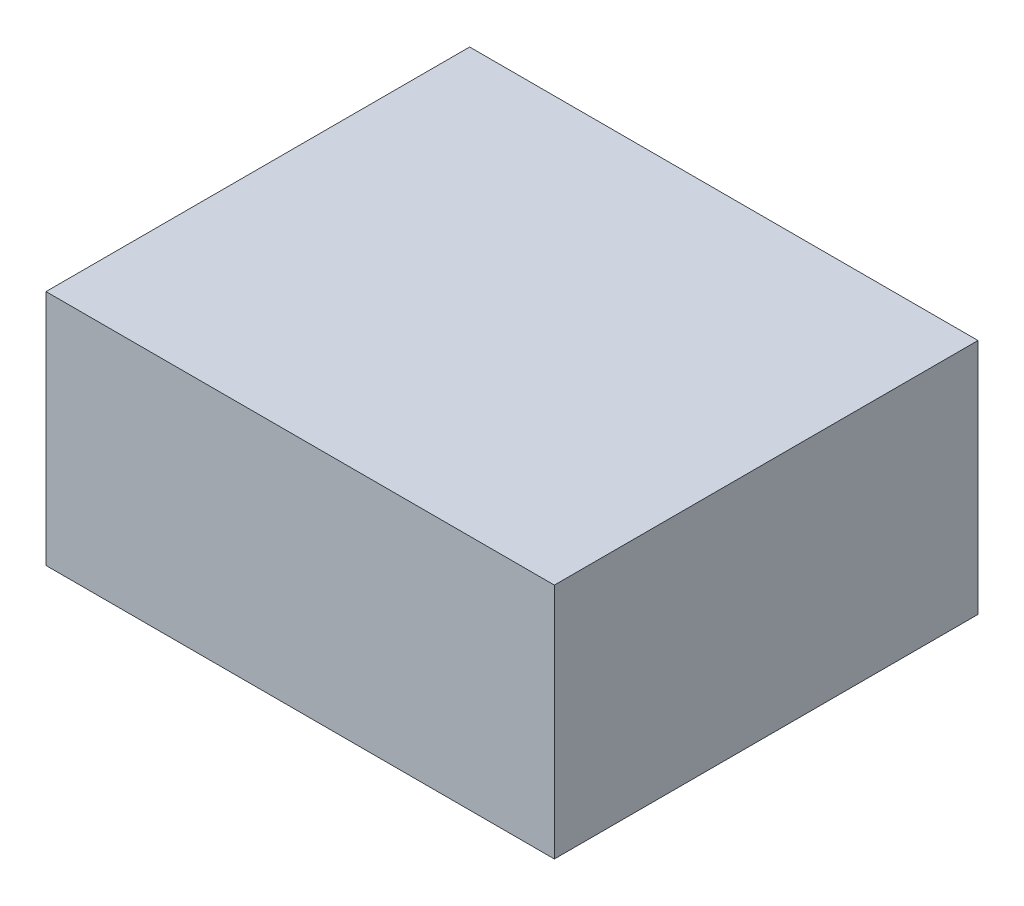
ISO-10303-21;
HEADER;
FILE_DESCRIPTION(('STEP AP214'),'2;1');
FILE_NAME('part.step','',(''),(''),'','','');
FILE_SCHEMA(('AUTOMOTIVE_DESIGN { 1 0 10303 214 1 1 1 1 }'));
ENDSEC;
DATA;
#1=APPLICATION_CONTEXT('core data for automotive mechanical design processes');
#2=APPLICATION_PROTOCOL_DEFINITION('international standard','automotive_design',2000,#1);
#3=PRODUCT_CONTEXT('',#1,'mechanical');
#4=PRODUCT('Part','Part','',(#3));
#5=PRODUCT_RELATED_PRODUCT_CATEGORY('part','',(#4));
#6=PRODUCT_DEFINITION_FORMATION('','',#4);
#7=PRODUCT_DEFINITION_CONTEXT('part definition',#1,'design');
#8=PRODUCT_DEFINITION('design','',#6,#7);
#9=PRODUCT_DEFINITION_SHAPE('','',#8);
#10=(LENGTH_UNIT() NAMED_UNIT(*) SI_UNIT(.MILLI.,.METRE.));
#11=(NAMED_UNIT(*) PLANE_ANGLE_UNIT() SI_UNIT($,.RADIAN.));
#12=(NAMED_UNIT(*) SI_UNIT($,.STERADIAN.) SOLID_ANGLE_UNIT());
#13=UNCERTAINTY_MEASURE_WITH_UNIT(LENGTH_MEASURE(1.E-05),#10,'distance_accuracy_value','');
#14=(GEOMETRIC_REPRESENTATION_CONTEXT(3) GLOBAL_UNCERTAINTY_ASSIGNED_CONTEXT((#13)) GLOBAL_UNIT_ASSIGNED_CONTEXT((#10,
#11,#12)) REPRESENTATION_CONTEXT('',''));
#15=CARTESIAN_POINT('',(0.,0.,0.));
#16=DIRECTION('',(0.,0.,1.));
#17=DIRECTION('',(1.,0.,0.));
#18=AXIS2_PLACEMENT_3D('',#15,#16,#17);
#19=CARTESIAN_POINT('',(-45.,42.,37.5));
#20=DIRECTION('',(1.,0.,0.));
#21=DIRECTION('',(0.,0.,-1.));
#22=AXIS2_PLACEMENT_3D('',#19,#20,#21);
#23=PLANE('',#22);
#24=DIRECTION('',(0.,-1.,0.));
#25=VECTOR('',#24,1.);
#26=CARTESIAN_POINT('',(-45.,42.,-37.5));
#27=LINE('',#26,#25);
#28=CARTESIAN_POINT('',(-45.,42.,-37.5));
#29=VERTEX_POINT('',#28);
#30=CARTESIAN_POINT('',(-45.,0.,-37.5));
#31=VERTEX_POINT('',#30);
#32=EDGE_CURVE('E105',#29,#31,#27,.T.);
#33=ORIENTED_EDGE('',*,*,#32,.T.);
#34=DIRECTION('',(0.,0.,-1.));
#35=VECTOR('',#34,1.);
#36=CARTESIAN_POINT('',(-45.,0.,37.5));
#37=LINE('',#36,#35);
#38=CARTESIAN_POINT('',(-45.,0.,37.5));
#39=VERTEX_POINT('',#38);
#40=EDGE_CURVE('E11',#39,#31,#37,.T.);
#41=ORIENTED_EDGE('',*,*,#40,.F.);
#42=DIRECTION('',(0.,-1.,0.));
#43=VECTOR('',#42,1.);
#44=CARTESIAN_POINT('',(-45.,42.,37.5));
#45=LINE('',#44,#43);
#46=CARTESIAN_POINT('',(-45.,42.,37.5));
#47=VERTEX_POINT('',#46);
#48=EDGE_CURVE('E89',#47,#39,#45,.T.);
#49=ORIENTED_EDGE('',*,*,#48,.F.);
#50=DIRECTION('',(0.,0.,-1.));
#51=VECTOR('',#50,1.);
#52=CARTESIAN_POINT('',(-45.,42.,37.5));
#53=LINE('',#52,#51);
#54=EDGE_CURVE('E97',#47,#29,#53,.T.);
#55=ORIENTED_EDGE('',*,*,#54,.T.);
#56=EDGE_LOOP('',(#33,#41,#49,#55));
#57=FACE_BOUND('',#56,.T.);
#58=ADVANCED_FACE('F39',(#57),#23,.F.);
#59=CARTESIAN_POINT('',(-45.,0.,37.5));
#60=DIRECTION('',(0.,1.,0.));
#61=DIRECTION('',(0.,0.,1.));
#62=AXIS2_PLACEMENT_3D('',#59,#60,#61);
#63=PLANE('',#62);
#64=DIRECTION('',(1.,0.,0.));
#65=VECTOR('',#64,1.);
#66=CARTESIAN_POINT('',(-45.,0.,-37.5));
#67=LINE('',#66,#65);
#68=CARTESIAN_POINT('',(45.,0.,-37.5));
#69=VERTEX_POINT('',#68);
#70=EDGE_CURVE('E92',#31,#69,#67,.T.);
#71=ORIENTED_EDGE('',*,*,#70,.T.);
#72=DIRECTION('',(0.,0.,-1.));
#73=VECTOR('',#72,1.);
#74=CARTESIAN_POINT('',(45.,0.,37.5));
#75=LINE('',#74,#73);
#76=CARTESIAN_POINT('',(45.,0.,37.5));
#77=VERTEX_POINT('',#76);
#78=EDGE_CURVE('E50',#77,#69,#75,.T.);
#79=ORIENTED_EDGE('',*,*,#78,.F.);
#80=DIRECTION('',(1.,0.,0.));
#81=VECTOR('',#80,1.);
#82=CARTESIAN_POINT('',(-45.,0.,37.5));
#83=LINE('',#82,#81);
#84=EDGE_CURVE('E82',#39,#77,#83,.T.);
#85=ORIENTED_EDGE('',*,*,#84,.F.);
#86=ORIENTED_EDGE('',*,*,#40,.T.);
#87=EDGE_LOOP('',(#71,#79,#85,#86));
#88=FACE_BOUND('',#87,.T.);
#89=ADVANCED_FACE('F93',(#88),#63,.F.);
#90=CARTESIAN_POINT('',(45.,0.,37.5));
#91=DIRECTION('',(-1.,0.,0.));
#92=DIRECTION('',(0.,0.,1.));
#93=AXIS2_PLACEMENT_3D('',#90,#91,#92);
#94=PLANE('',#93);
#95=DIRECTION('',(0.,1.,0.));
#96=VECTOR('',#95,1.);
#97=CARTESIAN_POINT('',(45.,0.,-37.5));
#98=LINE('',#97,#96);
#99=CARTESIAN_POINT('',(45.,42.,-37.5));
#100=VERTEX_POINT('',#99);
#101=EDGE_CURVE('E74',#69,#100,#98,.T.);
#102=ORIENTED_EDGE('',*,*,#101,.T.);
#103=DIRECTION('',(0.,0.,-1.));
#104=VECTOR('',#103,1.);
#105=CARTESIAN_POINT('',(45.,42.,37.5));
#106=LINE('',#105,#104);
#107=CARTESIAN_POINT('',(45.,42.,37.5));
#108=VERTEX_POINT('',#107);
#109=EDGE_CURVE('E94',#108,#100,#106,.T.);
#110=ORIENTED_EDGE('',*,*,#109,.F.);
#111=DIRECTION('',(0.,1.,0.));
#112=VECTOR('',#111,1.);
#113=CARTESIAN_POINT('',(45.,0.,37.5));
#114=LINE('',#113,#112);
#115=EDGE_CURVE('E88',#77,#108,#114,.T.);
#116=ORIENTED_EDGE('',*,*,#115,.F.);
#117=ORIENTED_EDGE('',*,*,#78,.T.);
#118=EDGE_LOOP('',(#102,#110,#116,#117));
#119=FACE_BOUND('',#118,.T.);
#120=ADVANCED_FACE('F96',(#119),#94,.F.);
#121=CARTESIAN_POINT('',(45.,42.,37.5));
#122=DIRECTION('',(0.,-1.,0.));
#123=DIRECTION('',(0.,0.,-1.));
#124=AXIS2_PLACEMENT_3D('',#121,#122,#123);
#125=PLANE('',#124);
#126=DIRECTION('',(-1.,0.,0.));
#127=VECTOR('',#126,1.);
#128=CARTESIAN_POINT('',(45.,42.,-37.5));
#129=LINE('',#128,#127);
#130=EDGE_CURVE('E76',#100,#29,#129,.T.);
#131=ORIENTED_EDGE('',*,*,#130,.T.);
#132=ORIENTED_EDGE('',*,*,#54,.F.);
#133=DIRECTION('',(-1.,0.,0.));
#134=VECTOR('',#133,1.);
#135=CARTESIAN_POINT('',(45.,42.,37.5));
#136=LINE('',#135,#134);
#137=EDGE_CURVE('E54',#108,#47,#136,.T.);
#138=ORIENTED_EDGE('',*,*,#137,.F.);
#139=ORIENTED_EDGE('',*,*,#109,.T.);
#140=EDGE_LOOP('',(#131,#132,#138,#139));
#141=FACE_BOUND('',#140,.T.);
#142=ADVANCED_FACE('F106',(#141),#125,.F.);
#143=CARTESIAN_POINT('',(0.,0.,37.5));
#144=DIRECTION('',(0.,0.,1.));
#145=DIRECTION('',(1.,0.,0.));
#146=AXIS2_PLACEMENT_3D('',#143,#144,#145);
#147=PLANE('',#146);
#148=ORIENTED_EDGE('',*,*,#48,.T.);
#149=ORIENTED_EDGE('',*,*,#84,.T.);
#150=ORIENTED_EDGE('',*,*,#115,.T.);
#151=ORIENTED_EDGE('',*,*,#137,.T.);
#152=EDGE_LOOP('',(#148,#149,#150,#151));
#153=FACE_BOUND('',#152,.T.);
#154=ADVANCED_FACE('F86',(#153),#147,.T.);
#155=CARTESIAN_POINT('',(0.,0.,-37.5));
#156=DIRECTION('',(0.,0.,1.));
#157=DIRECTION('',(1.,0.,0.));
#158=AXIS2_PLACEMENT_3D('',#155,#156,#157);
#159=PLANE('',#158);
#160=ORIENTED_EDGE('',*,*,#32,.F.);
#161=ORIENTED_EDGE('',*,*,#130,.F.);
#162=ORIENTED_EDGE('',*,*,#101,.F.);
#163=ORIENTED_EDGE('',*,*,#70,.F.);
#164=EDGE_LOOP('',(#160,#161,#162,#163));
#165=FACE_BOUND('',#164,.T.);
#166=ADVANCED_FACE('F115',(#165),#159,.F.);
#167=CLOSED_SHELL('',(#58,#89,#120,#142,#154,#166));
#168=MANIFOLD_SOLID_BREP('B2',#167);
#169=ADVANCED_BREP_SHAPE_REPRESENTATION('',(#18,#168),#14);
#170=SHAPE_DEFINITION_REPRESENTATION(#9,#169);
ENDSEC;
END-ISO-10303-21;
